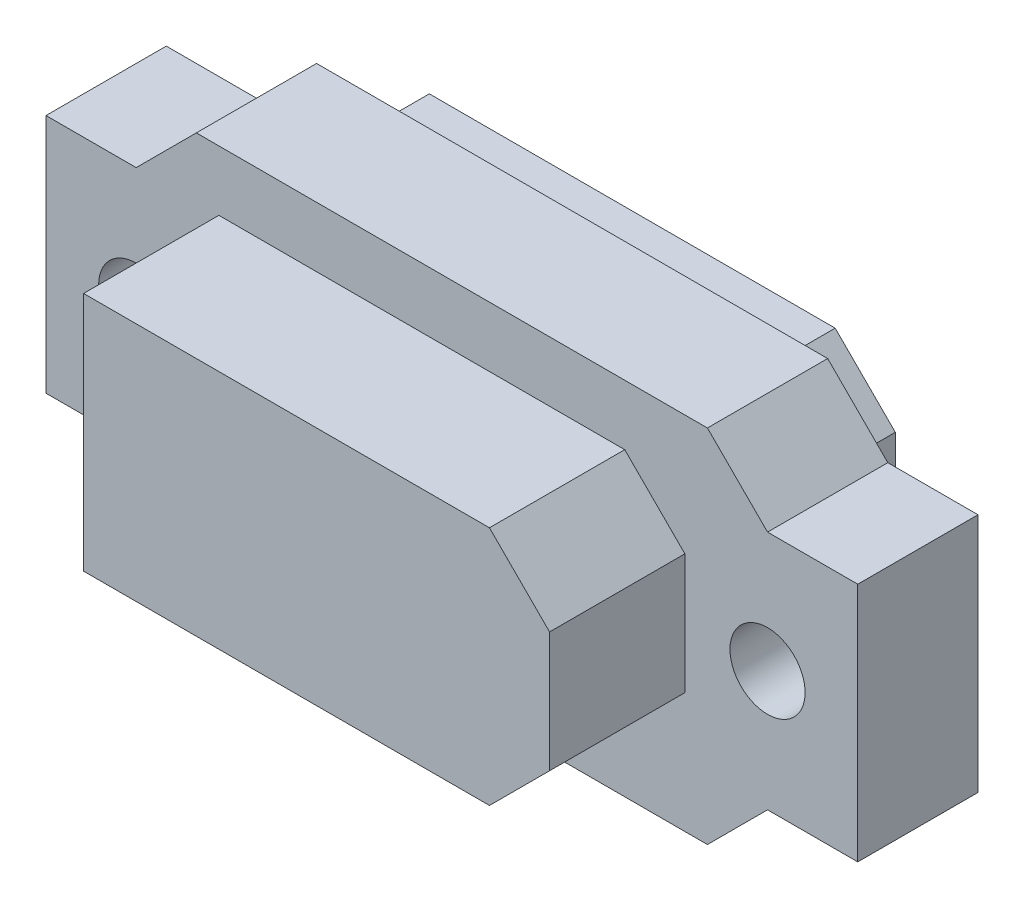
ISO-10303-21;
HEADER;
FILE_DESCRIPTION(('STEP AP214'),'2;1');
FILE_NAME('part.step','',(''),(''),'','','');
FILE_SCHEMA(('AUTOMOTIVE_DESIGN { 1 0 10303 214 1 1 1 1 }'));
ENDSEC;
DATA;
#1=APPLICATION_CONTEXT('core data for automotive mechanical design processes');
#2=APPLICATION_PROTOCOL_DEFINITION('international standard','automotive_design',2000,#1);
#3=PRODUCT_CONTEXT('',#1,'mechanical');
#4=PRODUCT('Part','Part','',(#3));
#5=PRODUCT_RELATED_PRODUCT_CATEGORY('part','',(#4));
#6=PRODUCT_DEFINITION_FORMATION('','',#4);
#7=PRODUCT_DEFINITION_CONTEXT('part definition',#1,'design');
#8=PRODUCT_DEFINITION('design','',#6,#7);
#9=PRODUCT_DEFINITION_SHAPE('','',#8);
#10=(LENGTH_UNIT() NAMED_UNIT(*) SI_UNIT(.MILLI.,.METRE.));
#11=(NAMED_UNIT(*) PLANE_ANGLE_UNIT() SI_UNIT($,.RADIAN.));
#12=(NAMED_UNIT(*) SI_UNIT($,.STERADIAN.) SOLID_ANGLE_UNIT());
#13=UNCERTAINTY_MEASURE_WITH_UNIT(LENGTH_MEASURE(1.E-05),#10,'distance_accuracy_value','');
#14=(GEOMETRIC_REPRESENTATION_CONTEXT(3) GLOBAL_UNCERTAINTY_ASSIGNED_CONTEXT((#13)) GLOBAL_UNIT_ASSIGNED_CONTEXT((#10,
#11,#12)) REPRESENTATION_CONTEXT('',''));
#15=CARTESIAN_POINT('',(0.,0.,0.));
#16=DIRECTION('',(0.,0.,1.));
#17=DIRECTION('',(1.,0.,0.));
#18=AXIS2_PLACEMENT_3D('',#15,#16,#17);
#19=CARTESIAN_POINT('',(-7.25,3.5,11.5));
#20=DIRECTION('',(0.,-1.,0.));
#21=DIRECTION('',(0.,0.,-1.));
#22=AXIS2_PLACEMENT_3D('',#19,#20,#21);
#23=PLANE('',#22);
#24=DIRECTION('',(0.,0.,-1.));
#25=VECTOR('',#24,1.);
#26=CARTESIAN_POINT('',(5.54289321881345,3.5,11.5));
#27=LINE('',#26,#25);
#28=CARTESIAN_POINT('',(5.54289321881345,3.5,9.5));
#29=VERTEX_POINT('',#28);
#30=CARTESIAN_POINT('',(5.54289321881345,3.5,0.));
#31=VERTEX_POINT('',#30);
#32=EDGE_CURVE('E259',#29,#31,#27,.T.);
#33=ORIENTED_EDGE('',*,*,#32,.F.);
#34=DIRECTION('',(-1.,0.,0.));
#35=VECTOR('',#34,1.);
#36=CARTESIAN_POINT('',(5.54289321881345,3.5,9.5));
#37=LINE('',#36,#35);
#38=CARTESIAN_POINT('',(-7.25,3.5,9.5));
#39=VERTEX_POINT('',#38);
#40=EDGE_CURVE('E63',#29,#39,#37,.T.);
#41=ORIENTED_EDGE('',*,*,#40,.T.);
#42=DIRECTION('',(0.,0.,-1.));
#43=VECTOR('',#42,1.);
#44=CARTESIAN_POINT('',(-7.25,3.5,11.5));
#45=LINE('',#44,#43);
#46=CARTESIAN_POINT('',(-7.25,3.5,0.));
#47=VERTEX_POINT('',#46);
#48=EDGE_CURVE('E257',#39,#47,#45,.T.);
#49=ORIENTED_EDGE('',*,*,#48,.T.);
#50=DIRECTION('',(-1.,0.,0.));
#51=VECTOR('',#50,1.);
#52=CARTESIAN_POINT('',(-7.25,3.5,0.));
#53=LINE('',#52,#51);
#54=EDGE_CURVE('E542',#31,#47,#53,.T.);
#55=ORIENTED_EDGE('',*,*,#54,.F.);
#56=EDGE_LOOP('',(#33,#41,#49,#55));
#57=FACE_BOUND('',#56,.T.);
#58=ADVANCED_FACE('F47',(#57),#23,.T.);
#59=CARTESIAN_POINT('',(-7.25,3.5,11.5));
#60=DIRECTION('',(1.,0.,0.));
#61=DIRECTION('',(0.,1.,0.));
#62=AXIS2_PLACEMENT_3D('',#59,#60,#61);
#63=PLANE('',#62);
#64=ORIENTED_EDGE('',*,*,#48,.F.);
#65=DIRECTION('',(0.,-1.,0.));
#66=VECTOR('',#65,1.);
#67=CARTESIAN_POINT('',(-7.25,3.5,9.5));
#68=LINE('',#67,#66);
#69=CARTESIAN_POINT('',(-7.25,-3.5,9.5));
#70=VERTEX_POINT('',#69);
#71=EDGE_CURVE('E245',#39,#70,#68,.T.);
#72=ORIENTED_EDGE('',*,*,#71,.T.);
#73=DIRECTION('',(0.,0.,-1.));
#74=VECTOR('',#73,1.);
#75=CARTESIAN_POINT('',(-7.25,-3.5,11.5));
#76=LINE('',#75,#74);
#77=CARTESIAN_POINT('',(-7.25,-3.5,0.));
#78=VERTEX_POINT('',#77);
#79=EDGE_CURVE('E269',#70,#78,#76,.T.);
#80=ORIENTED_EDGE('',*,*,#79,.T.);
#81=DIRECTION('',(0.,-1.,0.));
#82=VECTOR('',#81,1.);
#83=CARTESIAN_POINT('',(-7.25,3.5,0.));
#84=LINE('',#83,#82);
#85=EDGE_CURVE('E265',#47,#78,#84,.T.);
#86=ORIENTED_EDGE('',*,*,#85,.F.);
#87=EDGE_LOOP('',(#64,#72,#80,#86));
#88=FACE_BOUND('',#87,.T.);
#89=ADVANCED_FACE('F263',(#88),#63,.T.);
#90=CARTESIAN_POINT('',(-7.25,-3.5,11.5));
#91=DIRECTION('',(0.,1.,0.));
#92=DIRECTION('',(0.,0.,1.));
#93=AXIS2_PLACEMENT_3D('',#90,#91,#92);
#94=PLANE('',#93);
#95=ORIENTED_EDGE('',*,*,#79,.F.);
#96=DIRECTION('',(1.,0.,0.));
#97=VECTOR('',#96,1.);
#98=CARTESIAN_POINT('',(-7.25,-3.5,9.5));
#99=LINE('',#98,#97);
#100=CARTESIAN_POINT('',(5.54289321881345,-3.5,9.5));
#101=VERTEX_POINT('',#100);
#102=EDGE_CURVE('E248',#70,#101,#99,.T.);
#103=ORIENTED_EDGE('',*,*,#102,.T.);
#104=DIRECTION('',(0.,0.,-1.));
#105=VECTOR('',#104,1.);
#106=CARTESIAN_POINT('',(5.54289321881345,-3.5,11.5));
#107=LINE('',#106,#105);
#108=CARTESIAN_POINT('',(5.54289321881345,-3.5,0.));
#109=VERTEX_POINT('',#108);
#110=EDGE_CURVE('E276',#101,#109,#107,.T.);
#111=ORIENTED_EDGE('',*,*,#110,.T.);
#112=DIRECTION('',(1.,0.,0.));
#113=VECTOR('',#112,1.);
#114=CARTESIAN_POINT('',(-7.25,-3.5,0.));
#115=LINE('',#114,#113);
#116=EDGE_CURVE('E583',#78,#109,#115,.T.);
#117=ORIENTED_EDGE('',*,*,#116,.F.);
#118=EDGE_LOOP('',(#95,#103,#111,#117));
#119=FACE_BOUND('',#118,.T.);
#120=ADVANCED_FACE('F372',(#119),#94,.T.);
#121=CARTESIAN_POINT('',(5.54289321881345,-3.5,11.5));
#122=DIRECTION('',(-0.707106781186548,0.707106781186547,0.));
#123=DIRECTION('',(-0.707106781186547,-0.707106781186548,0.));
#124=AXIS2_PLACEMENT_3D('',#121,#122,#123);
#125=PLANE('',#124);
#126=ORIENTED_EDGE('',*,*,#110,.F.);
#127=DIRECTION('',(0.707106781186547,0.707106781186548,0.));
#128=VECTOR('',#127,1.);
#129=CARTESIAN_POINT('',(5.54289321881345,-3.5,9.5));
#130=LINE('',#129,#128);
#131=CARTESIAN_POINT('',(7.25,-1.79289321881345,9.5));
#132=VERTEX_POINT('',#131);
#133=EDGE_CURVE('E625',#101,#132,#130,.T.);
#134=ORIENTED_EDGE('',*,*,#133,.T.);
#135=DIRECTION('',(0.,0.,-1.));
#136=VECTOR('',#135,1.);
#137=CARTESIAN_POINT('',(7.25,-1.79289321881345,11.5));
#138=LINE('',#137,#136);
#139=CARTESIAN_POINT('',(7.25,-1.79289321881345,0.));
#140=VERTEX_POINT('',#139);
#141=EDGE_CURVE('E604',#132,#140,#138,.T.);
#142=ORIENTED_EDGE('',*,*,#141,.T.);
#143=DIRECTION('',(0.707106781186547,0.707106781186548,0.));
#144=VECTOR('',#143,1.);
#145=CARTESIAN_POINT('',(5.54289321881345,-3.5,0.));
#146=LINE('',#145,#144);
#147=EDGE_CURVE('E587',#109,#140,#146,.T.);
#148=ORIENTED_EDGE('',*,*,#147,.F.);
#149=EDGE_LOOP('',(#126,#134,#142,#148));
#150=FACE_BOUND('',#149,.T.);
#151=ADVANCED_FACE('F613',(#150),#125,.T.);
#152=CARTESIAN_POINT('',(7.25,1.79289321881345,11.5));
#153=DIRECTION('',(-1.,0.,0.));
#154=DIRECTION('',(0.,0.,1.));
#155=AXIS2_PLACEMENT_3D('',#152,#153,#154);
#156=PLANE('',#155);
#157=ORIENTED_EDGE('',*,*,#141,.F.);
#158=DIRECTION('',(0.,1.,0.));
#159=VECTOR('',#158,1.);
#160=CARTESIAN_POINT('',(7.25,-1.79289321881345,9.5));
#161=LINE('',#160,#159);
#162=CARTESIAN_POINT('',(7.25,1.79289321881345,9.5));
#163=VERTEX_POINT('',#162);
#164=EDGE_CURVE('E622',#132,#163,#161,.T.);
#165=ORIENTED_EDGE('',*,*,#164,.T.);
#166=DIRECTION('',(0.,0.,-1.));
#167=VECTOR('',#166,1.);
#168=CARTESIAN_POINT('',(7.25,1.79289321881345,11.5));
#169=LINE('',#168,#167);
#170=CARTESIAN_POINT('',(7.25,1.79289321881345,0.));
#171=VERTEX_POINT('',#170);
#172=EDGE_CURVE('E601',#163,#171,#169,.T.);
#173=ORIENTED_EDGE('',*,*,#172,.T.);
#174=DIRECTION('',(0.,1.,0.));
#175=VECTOR('',#174,1.);
#176=CARTESIAN_POINT('',(7.25,1.79289321881345,0.));
#177=LINE('',#176,#175);
#178=EDGE_CURVE('E591',#140,#171,#177,.T.);
#179=ORIENTED_EDGE('',*,*,#178,.F.);
#180=EDGE_LOOP('',(#157,#165,#173,#179));
#181=FACE_BOUND('',#180,.T.);
#182=ADVANCED_FACE('F749',(#181),#156,.T.);
#183=CARTESIAN_POINT('',(5.54289321881345,3.5,11.5));
#184=DIRECTION('',(-0.707106781186547,-0.707106781186548,0.));
#185=DIRECTION('',(0.707106781186548,-0.707106781186547,0.));
#186=AXIS2_PLACEMENT_3D('',#183,#184,#185);
#187=PLANE('',#186);
#188=ORIENTED_EDGE('',*,*,#172,.F.);
#189=DIRECTION('',(-0.707106781186548,0.707106781186547,0.));
#190=VECTOR('',#189,1.);
#191=CARTESIAN_POINT('',(7.25,1.79289321881345,9.5));
#192=LINE('',#191,#190);
#193=EDGE_CURVE('E465',#163,#29,#192,.T.);
#194=ORIENTED_EDGE('',*,*,#193,.T.);
#195=ORIENTED_EDGE('',*,*,#32,.T.);
#196=DIRECTION('',(-0.707106781186548,0.707106781186547,0.));
#197=VECTOR('',#196,1.);
#198=CARTESIAN_POINT('',(5.54289321881345,3.5,0.));
#199=LINE('',#198,#197);
#200=EDGE_CURVE('E595',#171,#31,#199,.T.);
#201=ORIENTED_EDGE('',*,*,#200,.F.);
#202=EDGE_LOOP('',(#188,#194,#195,#201));
#203=FACE_BOUND('',#202,.T.);
#204=ADVANCED_FACE('F420',(#203),#187,.T.);
#205=CARTESIAN_POINT('',(-7.75,4.,11.5));
#206=DIRECTION('',(1.,0.,0.));
#207=DIRECTION('',(0.,1.,0.));
#208=AXIS2_PLACEMENT_3D('',#205,#206,#207);
#209=PLANE('',#208);
#210=DIRECTION('',(0.,1.,0.));
#211=VECTOR('',#210,1.);
#212=CARTESIAN_POINT('',(-7.75,0.,7.));
#213=LINE('',#212,#211);
#214=CARTESIAN_POINT('',(-7.75,-4.,7.));
#215=VERTEX_POINT('',#214);
#216=CARTESIAN_POINT('',(-7.75,4.,7.));
#217=VERTEX_POINT('',#216);
#218=EDGE_CURVE('E71',#215,#217,#213,.T.);
#219=ORIENTED_EDGE('',*,*,#218,.F.);
#220=DIRECTION('',(0.,0.,-1.));
#221=VECTOR('',#220,1.);
#222=CARTESIAN_POINT('',(-7.75,-4.,11.5));
#223=LINE('',#222,#221);
#224=CARTESIAN_POINT('',(-7.75,-4.,11.5));
#225=VERTEX_POINT('',#224);
#226=EDGE_CURVE('E342',#225,#215,#223,.T.);
#227=ORIENTED_EDGE('',*,*,#226,.F.);
#228=DIRECTION('',(0.,-1.,0.));
#229=VECTOR('',#228,1.);
#230=CARTESIAN_POINT('',(-7.75,4.,11.5));
#231=LINE('',#230,#229);
#232=CARTESIAN_POINT('',(-7.75,4.,11.5));
#233=VERTEX_POINT('',#232);
#234=EDGE_CURVE('E280',#233,#225,#231,.T.);
#235=ORIENTED_EDGE('',*,*,#234,.F.);
#236=DIRECTION('',(0.,0.,-1.));
#237=VECTOR('',#236,1.);
#238=CARTESIAN_POINT('',(-7.75,4.,11.5));
#239=LINE('',#238,#237);
#240=EDGE_CURVE('E319',#233,#217,#239,.T.);
#241=ORIENTED_EDGE('',*,*,#240,.T.);
#242=EDGE_LOOP('',(#219,#227,#235,#241));
#243=FACE_BOUND('',#242,.T.);
#244=ADVANCED_FACE('F411',(#243),#209,.F.);
#245=CARTESIAN_POINT('',(-7.75,-4.,11.5));
#246=DIRECTION('',(0.,1.,0.));
#247=DIRECTION('',(0.,0.,1.));
#248=AXIS2_PLACEMENT_3D('',#245,#246,#247);
#249=PLANE('',#248);
#250=DIRECTION('',(-1.,0.,0.));
#251=VECTOR('',#250,1.);
#252=CARTESIAN_POINT('',(0.,-4.,7.));
#253=LINE('',#252,#251);
#254=CARTESIAN_POINT('',(5.75,-4.,7.));
#255=VERTEX_POINT('',#254);
#256=EDGE_CURVE('E423',#255,#215,#253,.T.);
#257=ORIENTED_EDGE('',*,*,#256,.F.);
#258=DIRECTION('',(0.,0.,-1.));
#259=VECTOR('',#258,1.);
#260=CARTESIAN_POINT('',(5.75,-4.,11.5));
#261=LINE('',#260,#259);
#262=CARTESIAN_POINT('',(5.75,-4.,11.5));
#263=VERTEX_POINT('',#262);
#264=EDGE_CURVE('E337',#263,#255,#261,.T.);
#265=ORIENTED_EDGE('',*,*,#264,.F.);
#266=DIRECTION('',(1.,0.,0.));
#267=VECTOR('',#266,1.);
#268=CARTESIAN_POINT('',(-7.75,-4.,11.5));
#269=LINE('',#268,#267);
#270=EDGE_CURVE('E284',#225,#263,#269,.T.);
#271=ORIENTED_EDGE('',*,*,#270,.F.);
#272=ORIENTED_EDGE('',*,*,#226,.T.);
#273=EDGE_LOOP('',(#257,#265,#271,#272));
#274=FACE_BOUND('',#273,.T.);
#275=ADVANCED_FACE('F406',(#274),#249,.F.);
#276=CARTESIAN_POINT('',(5.75,-4.,11.5));
#277=DIRECTION('',(-0.707106781186547,0.707106781186547,0.));
#278=DIRECTION('',(-0.707106781186548,-0.707106781186548,0.));
#279=AXIS2_PLACEMENT_3D('',#276,#277,#278);
#280=PLANE('',#279);
#281=DIRECTION('',(-0.707106781186548,-0.707106781186548,0.));
#282=VECTOR('',#281,1.);
#283=CARTESIAN_POINT('',(4.875,-4.875,7.));
#284=LINE('',#283,#282);
#285=CARTESIAN_POINT('',(7.75,-2.,7.));
#286=VERTEX_POINT('',#285);
#287=EDGE_CURVE('E428',#286,#255,#284,.T.);
#288=ORIENTED_EDGE('',*,*,#287,.F.);
#289=DIRECTION('',(0.,0.,-1.));
#290=VECTOR('',#289,1.);
#291=CARTESIAN_POINT('',(7.75,-2.,11.5));
#292=LINE('',#291,#290);
#293=CARTESIAN_POINT('',(7.75,-2.,11.5));
#294=VERTEX_POINT('',#293);
#295=EDGE_CURVE('E332',#294,#286,#292,.T.);
#296=ORIENTED_EDGE('',*,*,#295,.F.);
#297=DIRECTION('',(0.707106781186548,0.707106781186548,0.));
#298=VECTOR('',#297,1.);
#299=CARTESIAN_POINT('',(5.75,-4.,11.5));
#300=LINE('',#299,#298);
#301=EDGE_CURVE('E288',#263,#294,#300,.T.);
#302=ORIENTED_EDGE('',*,*,#301,.F.);
#303=ORIENTED_EDGE('',*,*,#264,.T.);
#304=EDGE_LOOP('',(#288,#296,#302,#303));
#305=FACE_BOUND('',#304,.T.);
#306=ADVANCED_FACE('F403',(#305),#280,.F.);
#307=CARTESIAN_POINT('',(7.75,2.,11.5));
#308=DIRECTION('',(-1.,0.,0.));
#309=DIRECTION('',(0.,0.,1.));
#310=AXIS2_PLACEMENT_3D('',#307,#308,#309);
#311=PLANE('',#310);
#312=DIRECTION('',(0.,-1.,0.));
#313=VECTOR('',#312,1.);
#314=CARTESIAN_POINT('',(7.75,0.,7.));
#315=LINE('',#314,#313);
#316=CARTESIAN_POINT('',(7.75,2.,7.));
#317=VERTEX_POINT('',#316);
#318=EDGE_CURVE('E435',#317,#286,#315,.T.);
#319=ORIENTED_EDGE('',*,*,#318,.F.);
#320=DIRECTION('',(0.,0.,-1.));
#321=VECTOR('',#320,1.);
#322=CARTESIAN_POINT('',(7.75,2.,11.5));
#323=LINE('',#322,#321);
#324=CARTESIAN_POINT('',(7.75,2.,11.5));
#325=VERTEX_POINT('',#324);
#326=EDGE_CURVE('E327',#325,#317,#323,.T.);
#327=ORIENTED_EDGE('',*,*,#326,.F.);
#328=DIRECTION('',(0.,1.,0.));
#329=VECTOR('',#328,1.);
#330=CARTESIAN_POINT('',(7.75,2.,11.5));
#331=LINE('',#330,#329);
#332=EDGE_CURVE('E291',#294,#325,#331,.T.);
#333=ORIENTED_EDGE('',*,*,#332,.F.);
#334=ORIENTED_EDGE('',*,*,#295,.T.);
#335=EDGE_LOOP('',(#319,#327,#333,#334));
#336=FACE_BOUND('',#335,.T.);
#337=ADVANCED_FACE('F399',(#336),#311,.F.);
#338=CARTESIAN_POINT('',(5.75,4.,11.5));
#339=DIRECTION('',(-0.707106781186547,-0.707106781186547,0.));
#340=DIRECTION('',(0.707106781186548,-0.707106781186548,0.));
#341=AXIS2_PLACEMENT_3D('',#338,#339,#340);
#342=PLANE('',#341);
#343=DIRECTION('',(0.707106781186548,-0.707106781186548,0.));
#344=VECTOR('',#343,1.);
#345=CARTESIAN_POINT('',(4.875,4.875,7.));
#346=LINE('',#345,#344);
#347=CARTESIAN_POINT('',(5.75,4.,7.));
#348=VERTEX_POINT('',#347);
#349=EDGE_CURVE('E439',#348,#317,#346,.T.);
#350=ORIENTED_EDGE('',*,*,#349,.F.);
#351=DIRECTION('',(0.,0.,-1.));
#352=VECTOR('',#351,1.);
#353=CARTESIAN_POINT('',(5.75,4.,11.5));
#354=LINE('',#353,#352);
#355=CARTESIAN_POINT('',(5.75,4.,11.5));
#356=VERTEX_POINT('',#355);
#357=EDGE_CURVE('E323',#356,#348,#354,.T.);
#358=ORIENTED_EDGE('',*,*,#357,.F.);
#359=DIRECTION('',(-0.707106781186548,0.707106781186548,0.));
#360=VECTOR('',#359,1.);
#361=CARTESIAN_POINT('',(5.75,4.,11.5));
#362=LINE('',#361,#360);
#363=EDGE_CURVE('E294',#325,#356,#362,.T.);
#364=ORIENTED_EDGE('',*,*,#363,.F.);
#365=ORIENTED_EDGE('',*,*,#326,.T.);
#366=EDGE_LOOP('',(#350,#358,#364,#365));
#367=FACE_BOUND('',#366,.T.);
#368=ADVANCED_FACE('F394',(#367),#342,.F.);
#369=CARTESIAN_POINT('',(-7.75,4.,11.5));
#370=DIRECTION('',(0.,-1.,0.));
#371=DIRECTION('',(0.,0.,-1.));
#372=AXIS2_PLACEMENT_3D('',#369,#370,#371);
#373=PLANE('',#372);
#374=DIRECTION('',(1.,0.,0.));
#375=VECTOR('',#374,1.);
#376=CARTESIAN_POINT('',(0.,4.,7.));
#377=LINE('',#376,#375);
#378=EDGE_CURVE('E445',#217,#348,#377,.T.);
#379=ORIENTED_EDGE('',*,*,#378,.F.);
#380=ORIENTED_EDGE('',*,*,#240,.F.);
#381=DIRECTION('',(-1.,0.,0.));
#382=VECTOR('',#381,1.);
#383=CARTESIAN_POINT('',(-7.75,4.,11.5));
#384=LINE('',#383,#382);
#385=EDGE_CURVE('E297',#356,#233,#384,.T.);
#386=ORIENTED_EDGE('',*,*,#385,.F.);
#387=ORIENTED_EDGE('',*,*,#357,.T.);
#388=EDGE_LOOP('',(#379,#380,#386,#387));
#389=FACE_BOUND('',#388,.T.);
#390=ADVANCED_FACE('F379',(#389),#373,.F.);
#391=CARTESIAN_POINT('',(0.,0.,11.5));
#392=DIRECTION('',(0.,0.,1.));
#393=DIRECTION('',(1.,0.,0.));
#394=AXIS2_PLACEMENT_3D('',#391,#392,#393);
#395=PLANE('',#394);
#396=ORIENTED_EDGE('',*,*,#234,.T.);
#397=ORIENTED_EDGE('',*,*,#270,.T.);
#398=ORIENTED_EDGE('',*,*,#301,.T.);
#399=ORIENTED_EDGE('',*,*,#332,.T.);
#400=ORIENTED_EDGE('',*,*,#363,.T.);
#401=ORIENTED_EDGE('',*,*,#385,.T.);
#402=EDGE_LOOP('',(#396,#397,#398,#399,#400,#401));
#403=FACE_BOUND('',#402,.T.);
#404=ADVANCED_FACE('F376',(#403),#395,.T.);
#405=CARTESIAN_POINT('',(0.,0.,0.));
#406=DIRECTION('',(0.,0.,1.));
#407=DIRECTION('',(1.,0.,0.));
#408=AXIS2_PLACEMENT_3D('',#405,#406,#407);
#409=PLANE('',#408);
#410=DIRECTION('',(0.,-1.,0.));
#411=VECTOR('',#410,1.);
#412=CARTESIAN_POINT('',(-7.75,4.,0.));
#413=LINE('',#412,#411);
#414=CARTESIAN_POINT('',(-7.75,4.,0.));
#415=VERTEX_POINT('',#414);
#416=CARTESIAN_POINT('',(-7.75,-4.,0.));
#417=VERTEX_POINT('',#416);
#418=EDGE_CURVE('E268',#415,#417,#413,.T.);
#419=ORIENTED_EDGE('',*,*,#418,.F.);
#420=DIRECTION('',(-1.,0.,0.));
#421=VECTOR('',#420,1.);
#422=CARTESIAN_POINT('',(-7.75,4.,0.));
#423=LINE('',#422,#421);
#424=CARTESIAN_POINT('',(5.75,4.,0.));
#425=VERTEX_POINT('',#424);
#426=EDGE_CURVE('E285',#425,#415,#423,.T.);
#427=ORIENTED_EDGE('',*,*,#426,.F.);
#428=DIRECTION('',(-0.707106781186548,0.707106781186548,0.));
#429=VECTOR('',#428,1.);
#430=CARTESIAN_POINT('',(5.75,4.,0.));
#431=LINE('',#430,#429);
#432=CARTESIAN_POINT('',(7.75,2.,0.));
#433=VERTEX_POINT('',#432);
#434=EDGE_CURVE('E312',#433,#425,#431,.T.);
#435=ORIENTED_EDGE('',*,*,#434,.F.);
#436=DIRECTION('',(0.,1.,0.));
#437=VECTOR('',#436,1.);
#438=CARTESIAN_POINT('',(7.75,2.,0.));
#439=LINE('',#438,#437);
#440=CARTESIAN_POINT('',(7.75,-2.,0.));
#441=VERTEX_POINT('',#440);
#442=EDGE_CURVE('E308',#441,#433,#439,.T.);
#443=ORIENTED_EDGE('',*,*,#442,.F.);
#444=DIRECTION('',(0.707106781186548,0.707106781186548,0.));
#445=VECTOR('',#444,1.);
#446=CARTESIAN_POINT('',(5.75,-4.,0.));
#447=LINE('',#446,#445);
#448=CARTESIAN_POINT('',(5.75,-4.,0.));
#449=VERTEX_POINT('',#448);
#450=EDGE_CURVE('E304',#449,#441,#447,.T.);
#451=ORIENTED_EDGE('',*,*,#450,.F.);
#452=DIRECTION('',(1.,0.,0.));
#453=VECTOR('',#452,1.);
#454=CARTESIAN_POINT('',(-7.75,-4.,0.));
#455=LINE('',#454,#453);
#456=EDGE_CURVE('E274',#417,#449,#455,.T.);
#457=ORIENTED_EDGE('',*,*,#456,.F.);
#458=EDGE_LOOP('',(#419,#427,#435,#443,#451,#457));
#459=FACE_BOUND('',#458,.T.);
#460=ORIENTED_EDGE('',*,*,#54,.T.);
#461=ORIENTED_EDGE('',*,*,#85,.T.);
#462=ORIENTED_EDGE('',*,*,#116,.T.);
#463=ORIENTED_EDGE('',*,*,#147,.T.);
#464=ORIENTED_EDGE('',*,*,#178,.T.);
#465=ORIENTED_EDGE('',*,*,#200,.T.);
#466=EDGE_LOOP('',(#460,#461,#462,#463,#464,#465));
#467=FACE_BOUND('',#466,.T.);
#468=ADVANCED_FACE('F378',(#459,#467),#409,.F.);
#469=CARTESIAN_POINT('',(-7.75,-4.,3.));
#470=VERTEX_POINT('',#469);
#471=EDGE_CURVE('E341',#470,#417,#223,.T.);
#472=ORIENTED_EDGE('',*,*,#471,.F.);
#473=DIRECTION('',(0.,1.,0.));
#474=VECTOR('',#473,1.);
#475=CARTESIAN_POINT('',(-7.75,0.,3.));
#476=LINE('',#475,#474);
#477=CARTESIAN_POINT('',(-7.75,4.,3.));
#478=VERTEX_POINT('',#477);
#479=EDGE_CURVE('E525',#470,#478,#476,.T.);
#480=ORIENTED_EDGE('',*,*,#479,.T.);
#481=EDGE_CURVE('E299',#478,#415,#239,.T.);
#482=ORIENTED_EDGE('',*,*,#481,.T.);
#483=ORIENTED_EDGE('',*,*,#418,.T.);
#484=EDGE_LOOP('',(#472,#480,#482,#483));
#485=FACE_BOUND('',#484,.T.);
#486=ADVANCED_FACE('F49',(#485),#209,.F.);
#487=CARTESIAN_POINT('',(5.75,-4.,3.));
#488=VERTEX_POINT('',#487);
#489=EDGE_CURVE('E336',#488,#449,#261,.T.);
#490=ORIENTED_EDGE('',*,*,#489,.F.);
#491=DIRECTION('',(-1.,0.,0.));
#492=VECTOR('',#491,1.);
#493=CARTESIAN_POINT('',(0.,-4.,3.));
#494=LINE('',#493,#492);
#495=EDGE_CURVE('E505',#488,#470,#494,.T.);
#496=ORIENTED_EDGE('',*,*,#495,.T.);
#497=ORIENTED_EDGE('',*,*,#471,.T.);
#498=ORIENTED_EDGE('',*,*,#456,.T.);
#499=EDGE_LOOP('',(#490,#496,#497,#498));
#500=FACE_BOUND('',#499,.T.);
#501=ADVANCED_FACE('F401',(#500),#249,.F.);
#502=CARTESIAN_POINT('',(7.75,-2.,3.));
#503=VERTEX_POINT('',#502);
#504=EDGE_CURVE('E331',#503,#441,#292,.T.);
#505=ORIENTED_EDGE('',*,*,#504,.F.);
#506=DIRECTION('',(-0.707106781186548,-0.707106781186548,0.));
#507=VECTOR('',#506,1.);
#508=CARTESIAN_POINT('',(4.875,-4.875,3.));
#509=LINE('',#508,#507);
#510=EDGE_CURVE('E509',#503,#488,#509,.T.);
#511=ORIENTED_EDGE('',*,*,#510,.T.);
#512=ORIENTED_EDGE('',*,*,#489,.T.);
#513=ORIENTED_EDGE('',*,*,#450,.T.);
#514=EDGE_LOOP('',(#505,#511,#512,#513));
#515=FACE_BOUND('',#514,.T.);
#516=ADVANCED_FACE('F397',(#515),#280,.F.);
#517=CARTESIAN_POINT('',(7.75,2.,3.));
#518=VERTEX_POINT('',#517);
#519=EDGE_CURVE('E326',#518,#433,#323,.T.);
#520=ORIENTED_EDGE('',*,*,#519,.F.);
#521=DIRECTION('',(0.,-1.,0.));
#522=VECTOR('',#521,1.);
#523=CARTESIAN_POINT('',(7.75,0.,3.));
#524=LINE('',#523,#522);
#525=EDGE_CURVE('E513',#518,#503,#524,.T.);
#526=ORIENTED_EDGE('',*,*,#525,.T.);
#527=ORIENTED_EDGE('',*,*,#504,.T.);
#528=ORIENTED_EDGE('',*,*,#442,.T.);
#529=EDGE_LOOP('',(#520,#526,#527,#528));
#530=FACE_BOUND('',#529,.T.);
#531=ADVANCED_FACE('F392',(#530),#311,.F.);
#532=CARTESIAN_POINT('',(5.75,4.,3.));
#533=VERTEX_POINT('',#532);
#534=EDGE_CURVE('E322',#533,#425,#354,.T.);
#535=ORIENTED_EDGE('',*,*,#534,.F.);
#536=DIRECTION('',(0.707106781186548,-0.707106781186548,0.));
#537=VECTOR('',#536,1.);
#538=CARTESIAN_POINT('',(4.875,4.875,3.));
#539=LINE('',#538,#537);
#540=EDGE_CURVE('E517',#533,#518,#539,.T.);
#541=ORIENTED_EDGE('',*,*,#540,.T.);
#542=ORIENTED_EDGE('',*,*,#519,.T.);
#543=ORIENTED_EDGE('',*,*,#434,.T.);
#544=EDGE_LOOP('',(#535,#541,#542,#543));
#545=FACE_BOUND('',#544,.T.);
#546=ADVANCED_FACE('F388',(#545),#342,.F.);
#547=ORIENTED_EDGE('',*,*,#481,.F.);
#548=DIRECTION('',(1.,0.,0.));
#549=VECTOR('',#548,1.);
#550=CARTESIAN_POINT('',(0.,4.,3.));
#551=LINE('',#550,#549);
#552=EDGE_CURVE('E521',#478,#533,#551,.T.);
#553=ORIENTED_EDGE('',*,*,#552,.T.);
#554=ORIENTED_EDGE('',*,*,#534,.T.);
#555=ORIENTED_EDGE('',*,*,#426,.T.);
#556=EDGE_LOOP('',(#547,#553,#554,#555));
#557=FACE_BOUND('',#556,.T.);
#558=ADVANCED_FACE('F384',(#557),#373,.F.);
#559=CARTESIAN_POINT('',(13.5,0.,7.));
#560=DIRECTION('',(-1.,0.,0.));
#561=DIRECTION('',(0.,-1.,0.));
#562=AXIS2_PLACEMENT_3D('',#559,#560,#561);
#563=PLANE('',#562);
#564=DIRECTION('',(0.,1.,0.));
#565=VECTOR('',#564,1.);
#566=CARTESIAN_POINT('',(13.5,0.,3.));
#567=LINE('',#566,#565);
#568=CARTESIAN_POINT('',(13.5,-4.,3.));
#569=VERTEX_POINT('',#568);
#570=CARTESIAN_POINT('',(13.5,4.,3.));
#571=VERTEX_POINT('',#570);
#572=EDGE_CURVE('E460',#569,#571,#567,.T.);
#573=ORIENTED_EDGE('',*,*,#572,.T.);
#574=DIRECTION('',(0.,0.,-1.));
#575=VECTOR('',#574,1.);
#576=CARTESIAN_POINT('',(13.5,4.,7.));
#577=LINE('',#576,#575);
#578=CARTESIAN_POINT('',(13.5,4.,7.));
#579=VERTEX_POINT('',#578);
#580=EDGE_CURVE('E538',#579,#571,#577,.T.);
#581=ORIENTED_EDGE('',*,*,#580,.F.);
#582=DIRECTION('',(0.,1.,0.));
#583=VECTOR('',#582,1.);
#584=CARTESIAN_POINT('',(13.5,0.,7.));
#585=LINE('',#584,#583);
#586=CARTESIAN_POINT('',(13.5,-4.,7.));
#587=VERTEX_POINT('',#586);
#588=EDGE_CURVE('E537',#587,#579,#585,.T.);
#589=ORIENTED_EDGE('',*,*,#588,.F.);
#590=DIRECTION('',(0.,0.,-1.));
#591=VECTOR('',#590,1.);
#592=CARTESIAN_POINT('',(13.5,-4.,7.));
#593=LINE('',#592,#591);
#594=EDGE_CURVE('E459',#587,#569,#593,.T.);
#595=ORIENTED_EDGE('',*,*,#594,.T.);
#596=EDGE_LOOP('',(#573,#581,#589,#595));
#597=FACE_BOUND('',#596,.T.);
#598=ADVANCED_FACE('F387',(#597),#563,.F.);
#599=CARTESIAN_POINT('',(0.,4.,7.));
#600=DIRECTION('',(0.,-1.,0.));
#601=DIRECTION('',(0.,0.,-1.));
#602=AXIS2_PLACEMENT_3D('',#599,#600,#601);
#603=PLANE('',#602);
#604=DIRECTION('',(-1.,0.,0.));
#605=VECTOR('',#604,1.);
#606=CARTESIAN_POINT('',(0.,4.,3.));
#607=LINE('',#606,#605);
#608=CARTESIAN_POINT('',(10.5,4.,3.));
#609=VERTEX_POINT('',#608);
#610=EDGE_CURVE('E502',#571,#609,#607,.T.);
#611=ORIENTED_EDGE('',*,*,#610,.T.);
#612=DIRECTION('',(0.,0.,-1.));
#613=VECTOR('',#612,1.);
#614=CARTESIAN_POINT('',(10.5,4.,7.));
#615=LINE('',#614,#613);
#616=CARTESIAN_POINT('',(10.5,4.,7.));
#617=VERTEX_POINT('',#616);
#618=EDGE_CURVE('E543',#617,#609,#615,.T.);
#619=ORIENTED_EDGE('',*,*,#618,.F.);
#620=DIRECTION('',(-1.,0.,0.));
#621=VECTOR('',#620,1.);
#622=CARTESIAN_POINT('',(0.,4.,7.));
#623=LINE('',#622,#621);
#624=EDGE_CURVE('E429',#579,#617,#623,.T.);
#625=ORIENTED_EDGE('',*,*,#624,.F.);
#626=ORIENTED_EDGE('',*,*,#580,.T.);
#627=EDGE_LOOP('',(#611,#619,#625,#626));
#628=FACE_BOUND('',#627,.T.);
#629=ADVANCED_FACE('F675',(#628),#603,.F.);
#630=CARTESIAN_POINT('',(7.25000000000002,7.24999999999999,7.));
#631=DIRECTION('',(-0.707106781186549,-0.707106781186546,0.));
#632=DIRECTION('',(0.707106781186546,-0.707106781186549,0.));
#633=AXIS2_PLACEMENT_3D('',#630,#631,#632);
#634=PLANE('',#633);
#635=DIRECTION('',(-0.707106781186546,0.707106781186549,0.));
#636=VECTOR('',#635,1.);
#637=CARTESIAN_POINT('',(7.25000000000002,7.24999999999999,3.));
#638=LINE('',#637,#636);
#639=CARTESIAN_POINT('',(8.50000000000001,6.,3.));
#640=VERTEX_POINT('',#639);
#641=EDGE_CURVE('E499',#609,#640,#638,.T.);
#642=ORIENTED_EDGE('',*,*,#641,.T.);
#643=DIRECTION('',(0.,0.,-1.));
#644=VECTOR('',#643,1.);
#645=CARTESIAN_POINT('',(8.50000000000001,6.,7.));
#646=LINE('',#645,#644);
#647=CARTESIAN_POINT('',(8.50000000000001,6.,7.));
#648=VERTEX_POINT('',#647);
#649=EDGE_CURVE('E547',#648,#640,#646,.T.);
#650=ORIENTED_EDGE('',*,*,#649,.F.);
#651=DIRECTION('',(-0.707106781186546,0.707106781186549,0.));
#652=VECTOR('',#651,1.);
#653=CARTESIAN_POINT('',(7.25000000000002,7.24999999999999,7.));
#654=LINE('',#653,#652);
#655=EDGE_CURVE('E664',#617,#648,#654,.T.);
#656=ORIENTED_EDGE('',*,*,#655,.F.);
#657=ORIENTED_EDGE('',*,*,#618,.T.);
#658=EDGE_LOOP('',(#642,#650,#656,#657));
#659=FACE_BOUND('',#658,.T.);
#660=ADVANCED_FACE('F678',(#659),#634,.F.);
#661=CARTESIAN_POINT('',(0.,6.,7.));
#662=DIRECTION('',(0.,-1.,0.));
#663=DIRECTION('',(0.,0.,-1.));
#664=AXIS2_PLACEMENT_3D('',#661,#662,#663);
#665=PLANE('',#664);
#666=DIRECTION('',(-1.,0.,0.));
#667=VECTOR('',#666,1.);
#668=CARTESIAN_POINT('',(0.,6.,3.));
#669=LINE('',#668,#667);
#670=CARTESIAN_POINT('',(-8.50000000000001,6.,3.));
#671=VERTEX_POINT('',#670);
#672=EDGE_CURVE('E495',#640,#671,#669,.T.);
#673=ORIENTED_EDGE('',*,*,#672,.T.);
#674=DIRECTION('',(0.,0.,-1.));
#675=VECTOR('',#674,1.);
#676=CARTESIAN_POINT('',(-8.50000000000001,6.,7.));
#677=LINE('',#676,#675);
#678=CARTESIAN_POINT('',(-8.50000000000001,6.,7.));
#679=VERTEX_POINT('',#678);
#680=EDGE_CURVE('E551',#679,#671,#677,.T.);
#681=ORIENTED_EDGE('',*,*,#680,.F.);
#682=DIRECTION('',(-1.,0.,0.));
#683=VECTOR('',#682,1.);
#684=CARTESIAN_POINT('',(0.,6.,7.));
#685=LINE('',#684,#683);
#686=EDGE_CURVE('E661',#648,#679,#685,.T.);
#687=ORIENTED_EDGE('',*,*,#686,.F.);
#688=ORIENTED_EDGE('',*,*,#649,.T.);
#689=EDGE_LOOP('',(#673,#681,#687,#688));
#690=FACE_BOUND('',#689,.T.);
#691=ADVANCED_FACE('F683',(#690),#665,.F.);
#692=CARTESIAN_POINT('',(-7.25000000000002,7.24999999999999,7.));
#693=DIRECTION('',(-0.707106781186549,0.707106781186546,0.));
#694=DIRECTION('',(-0.707106781186546,-0.707106781186549,0.));
#695=AXIS2_PLACEMENT_3D('',#692,#693,#694);
#696=PLANE('',#695);
#697=DIRECTION('',(0.707106781186546,0.707106781186549,0.));
#698=VECTOR('',#697,1.);
#699=CARTESIAN_POINT('',(-7.25000000000002,7.24999999999999,3.));
#700=LINE('',#699,#698);
#701=CARTESIAN_POINT('',(-10.5,4.,3.));
#702=VERTEX_POINT('',#701);
#703=EDGE_CURVE('E491',#702,#671,#700,.T.);
#704=ORIENTED_EDGE('',*,*,#703,.F.);
#705=DIRECTION('',(0.,0.,-1.));
#706=VECTOR('',#705,1.);
#707=CARTESIAN_POINT('',(-10.5,4.,7.));
#708=LINE('',#707,#706);
#709=CARTESIAN_POINT('',(-10.5,4.,7.));
#710=VERTEX_POINT('',#709);
#711=EDGE_CURVE('E554',#710,#702,#708,.T.);
#712=ORIENTED_EDGE('',*,*,#711,.F.);
#713=DIRECTION('',(0.707106781186546,0.707106781186549,0.));
#714=VECTOR('',#713,1.);
#715=CARTESIAN_POINT('',(-7.25000000000002,7.24999999999999,7.));
#716=LINE('',#715,#714);
#717=EDGE_CURVE('E657',#710,#679,#716,.T.);
#718=ORIENTED_EDGE('',*,*,#717,.T.);
#719=ORIENTED_EDGE('',*,*,#680,.T.);
#720=EDGE_LOOP('',(#704,#712,#718,#719));
#721=FACE_BOUND('',#720,.T.);
#722=ADVANCED_FACE('F720',(#721),#696,.T.);
#723=CARTESIAN_POINT('',(0.,4.,7.));
#724=DIRECTION('',(0.,1.,0.));
#725=DIRECTION('',(0.,0.,1.));
#726=AXIS2_PLACEMENT_3D('',#723,#724,#725);
#727=PLANE('',#726);
#728=DIRECTION('',(1.,0.,0.));
#729=VECTOR('',#728,1.);
#730=CARTESIAN_POINT('',(0.,4.,3.));
#731=LINE('',#730,#729);
#732=CARTESIAN_POINT('',(-13.5,4.,3.));
#733=VERTEX_POINT('',#732);
#734=EDGE_CURVE('E487',#733,#702,#731,.T.);
#735=ORIENTED_EDGE('',*,*,#734,.F.);
#736=DIRECTION('',(0.,0.,-1.));
#737=VECTOR('',#736,1.);
#738=CARTESIAN_POINT('',(-13.5,4.,7.));
#739=LINE('',#738,#737);
#740=CARTESIAN_POINT('',(-13.5,4.,7.));
#741=VERTEX_POINT('',#740);
#742=EDGE_CURVE('E557',#741,#733,#739,.T.);
#743=ORIENTED_EDGE('',*,*,#742,.F.);
#744=DIRECTION('',(1.,0.,0.));
#745=VECTOR('',#744,1.);
#746=CARTESIAN_POINT('',(0.,4.,7.));
#747=LINE('',#746,#745);
#748=EDGE_CURVE('E653',#741,#710,#747,.T.);
#749=ORIENTED_EDGE('',*,*,#748,.T.);
#750=ORIENTED_EDGE('',*,*,#711,.T.);
#751=EDGE_LOOP('',(#735,#743,#749,#750));
#752=FACE_BOUND('',#751,.T.);
#753=ADVANCED_FACE('F689',(#752),#727,.T.);
#754=CARTESIAN_POINT('',(-13.5,0.,7.));
#755=DIRECTION('',(1.,0.,0.));
#756=DIRECTION('',(0.,1.,0.));
#757=AXIS2_PLACEMENT_3D('',#754,#755,#756);
#758=PLANE('',#757);
#759=DIRECTION('',(0.,-1.,0.));
#760=VECTOR('',#759,1.);
#761=CARTESIAN_POINT('',(-13.5,0.,3.));
#762=LINE('',#761,#760);
#763=CARTESIAN_POINT('',(-13.5,-4.,3.));
#764=VERTEX_POINT('',#763);
#765=EDGE_CURVE('E484',#733,#764,#762,.T.);
#766=ORIENTED_EDGE('',*,*,#765,.T.);
#767=DIRECTION('',(0.,0.,-1.));
#768=VECTOR('',#767,1.);
#769=CARTESIAN_POINT('',(-13.5,-4.,7.));
#770=LINE('',#769,#768);
#771=CARTESIAN_POINT('',(-13.5,-4.,7.));
#772=VERTEX_POINT('',#771);
#773=EDGE_CURVE('E560',#772,#764,#770,.T.);
#774=ORIENTED_EDGE('',*,*,#773,.F.);
#775=DIRECTION('',(0.,-1.,0.));
#776=VECTOR('',#775,1.);
#777=CARTESIAN_POINT('',(-13.5,0.,7.));
#778=LINE('',#777,#776);
#779=EDGE_CURVE('E650',#741,#772,#778,.T.);
#780=ORIENTED_EDGE('',*,*,#779,.F.);
#781=ORIENTED_EDGE('',*,*,#742,.T.);
#782=EDGE_LOOP('',(#766,#774,#780,#781));
#783=FACE_BOUND('',#782,.T.);
#784=ADVANCED_FACE('F695',(#783),#758,.F.);
#785=CARTESIAN_POINT('',(0.,-4.,7.));
#786=DIRECTION('',(0.,1.,0.));
#787=DIRECTION('',(0.,0.,1.));
#788=AXIS2_PLACEMENT_3D('',#785,#786,#787);
#789=PLANE('',#788);
#790=DIRECTION('',(1.,0.,0.));
#791=VECTOR('',#790,1.);
#792=CARTESIAN_POINT('',(0.,-4.,3.));
#793=LINE('',#792,#791);
#794=CARTESIAN_POINT('',(-10.5,-4.,3.));
#795=VERTEX_POINT('',#794);
#796=EDGE_CURVE('E481',#764,#795,#793,.T.);
#797=ORIENTED_EDGE('',*,*,#796,.T.);
#798=DIRECTION('',(0.,0.,-1.));
#799=VECTOR('',#798,1.);
#800=CARTESIAN_POINT('',(-10.5,-4.,7.));
#801=LINE('',#800,#799);
#802=CARTESIAN_POINT('',(-10.5,-4.,7.));
#803=VERTEX_POINT('',#802);
#804=EDGE_CURVE('E564',#803,#795,#801,.T.);
#805=ORIENTED_EDGE('',*,*,#804,.F.);
#806=DIRECTION('',(1.,0.,0.));
#807=VECTOR('',#806,1.);
#808=CARTESIAN_POINT('',(0.,-4.,7.));
#809=LINE('',#808,#807);
#810=EDGE_CURVE('E647',#772,#803,#809,.T.);
#811=ORIENTED_EDGE('',*,*,#810,.F.);
#812=ORIENTED_EDGE('',*,*,#773,.T.);
#813=EDGE_LOOP('',(#797,#805,#811,#812));
#814=FACE_BOUND('',#813,.T.);
#815=ADVANCED_FACE('F702',(#814),#789,.F.);
#816=CARTESIAN_POINT('',(-7.25000000000002,-7.24999999999999,7.));
#817=DIRECTION('',(0.707106781186549,0.707106781186546,0.));
#818=DIRECTION('',(-0.707106781186546,0.707106781186549,0.));
#819=AXIS2_PLACEMENT_3D('',#816,#817,#818);
#820=PLANE('',#819);
#821=DIRECTION('',(0.707106781186546,-0.707106781186549,0.));
#822=VECTOR('',#821,1.);
#823=CARTESIAN_POINT('',(-7.25000000000002,-7.24999999999999,3.));
#824=LINE('',#823,#822);
#825=CARTESIAN_POINT('',(-8.50000000000001,-6.,3.));
#826=VERTEX_POINT('',#825);
#827=EDGE_CURVE('E477',#795,#826,#824,.T.);
#828=ORIENTED_EDGE('',*,*,#827,.T.);
#829=DIRECTION('',(0.,0.,-1.));
#830=VECTOR('',#829,1.);
#831=CARTESIAN_POINT('',(-8.50000000000001,-6.,7.));
#832=LINE('',#831,#830);
#833=CARTESIAN_POINT('',(-8.50000000000001,-6.,7.));
#834=VERTEX_POINT('',#833);
#835=EDGE_CURVE('E568',#834,#826,#832,.T.);
#836=ORIENTED_EDGE('',*,*,#835,.F.);
#837=DIRECTION('',(0.707106781186546,-0.707106781186549,0.));
#838=VECTOR('',#837,1.);
#839=CARTESIAN_POINT('',(-7.25000000000002,-7.24999999999999,7.));
#840=LINE('',#839,#838);
#841=EDGE_CURVE('E644',#803,#834,#840,.T.);
#842=ORIENTED_EDGE('',*,*,#841,.F.);
#843=ORIENTED_EDGE('',*,*,#804,.T.);
#844=EDGE_LOOP('',(#828,#836,#842,#843));
#845=FACE_BOUND('',#844,.T.);
#846=ADVANCED_FACE('F706',(#845),#820,.F.);
#847=CARTESIAN_POINT('',(0.,-6.,7.));
#848=DIRECTION('',(0.,-1.,0.));
#849=DIRECTION('',(0.,0.,-1.));
#850=AXIS2_PLACEMENT_3D('',#847,#848,#849);
#851=PLANE('',#850);
#852=DIRECTION('',(-1.,0.,0.));
#853=VECTOR('',#852,1.);
#854=CARTESIAN_POINT('',(0.,-6.,3.));
#855=LINE('',#854,#853);
#856=CARTESIAN_POINT('',(8.50000000000001,-6.,3.));
#857=VERTEX_POINT('',#856);
#858=EDGE_CURVE('E473',#857,#826,#855,.T.);
#859=ORIENTED_EDGE('',*,*,#858,.F.);
#860=DIRECTION('',(0.,0.,-1.));
#861=VECTOR('',#860,1.);
#862=CARTESIAN_POINT('',(8.50000000000001,-6.,7.));
#863=LINE('',#862,#861);
#864=CARTESIAN_POINT('',(8.50000000000001,-6.,7.));
#865=VERTEX_POINT('',#864);
#866=EDGE_CURVE('E571',#865,#857,#863,.T.);
#867=ORIENTED_EDGE('',*,*,#866,.F.);
#868=DIRECTION('',(-1.,0.,0.));
#869=VECTOR('',#868,1.);
#870=CARTESIAN_POINT('',(0.,-6.,7.));
#871=LINE('',#870,#869);
#872=EDGE_CURVE('E640',#865,#834,#871,.T.);
#873=ORIENTED_EDGE('',*,*,#872,.T.);
#874=ORIENTED_EDGE('',*,*,#835,.T.);
#875=EDGE_LOOP('',(#859,#867,#873,#874));
#876=FACE_BOUND('',#875,.T.);
#877=ADVANCED_FACE('F709',(#876),#851,.T.);
#878=CARTESIAN_POINT('',(7.25000000000002,-7.24999999999999,7.));
#879=DIRECTION('',(0.707106781186549,-0.707106781186546,0.));
#880=DIRECTION('',(0.707106781186546,0.707106781186549,0.));
#881=AXIS2_PLACEMENT_3D('',#878,#879,#880);
#882=PLANE('',#881);
#883=DIRECTION('',(-0.707106781186546,-0.707106781186549,0.));
#884=VECTOR('',#883,1.);
#885=CARTESIAN_POINT('',(7.25000000000002,-7.24999999999999,3.));
#886=LINE('',#885,#884);
#887=CARTESIAN_POINT('',(10.5,-4.,3.));
#888=VERTEX_POINT('',#887);
#889=EDGE_CURVE('E469',#888,#857,#886,.T.);
#890=ORIENTED_EDGE('',*,*,#889,.F.);
#891=DIRECTION('',(0.,0.,-1.));
#892=VECTOR('',#891,1.);
#893=CARTESIAN_POINT('',(10.5,-4.,7.));
#894=LINE('',#893,#892);
#895=CARTESIAN_POINT('',(10.5,-4.,7.));
#896=VERTEX_POINT('',#895);
#897=EDGE_CURVE('E574',#896,#888,#894,.T.);
#898=ORIENTED_EDGE('',*,*,#897,.F.);
#899=DIRECTION('',(-0.707106781186546,-0.707106781186549,0.));
#900=VECTOR('',#899,1.);
#901=CARTESIAN_POINT('',(7.25000000000002,-7.24999999999999,7.));
#902=LINE('',#901,#900);
#903=EDGE_CURVE('E636',#896,#865,#902,.T.);
#904=ORIENTED_EDGE('',*,*,#903,.T.);
#905=ORIENTED_EDGE('',*,*,#866,.T.);
#906=EDGE_LOOP('',(#890,#898,#904,#905));
#907=FACE_BOUND('',#906,.T.);
#908=ADVANCED_FACE('F713',(#907),#882,.T.);
#909=CARTESIAN_POINT('',(10.5,0.,7.));
#910=DIRECTION('',(0.,0.,-1.));
#911=DIRECTION('',(-1.,0.,0.));
#912=AXIS2_PLACEMENT_3D('',#909,#910,#911);
#913=CYLINDRICAL_SURFACE('',#912,1.25);
#914=CARTESIAN_POINT('',(10.5,0.,7.));
#915=DIRECTION('',(0.,0.,-1.));
#916=DIRECTION('',(-1.,0.,0.));
#917=AXIS2_PLACEMENT_3D('',#914,#915,#916);
#918=CIRCLE('',#917,1.25);
#919=CARTESIAN_POINT('',(9.25,0.,7.));
#920=VERTEX_POINT('',#919);
#921=EDGE_CURVE('E451',#920,#920,#918,.T.);
#922=ORIENTED_EDGE('',*,*,#921,.F.);
#923=EDGE_LOOP('',(#922));
#924=FACE_BOUND('',#923,.T.);
#925=CARTESIAN_POINT('',(10.5,0.,3.));
#926=DIRECTION('',(0.,0.,-1.));
#927=DIRECTION('',(-1.,0.,0.));
#928=AXIS2_PLACEMENT_3D('',#925,#926,#927);
#929=CIRCLE('',#928,1.25);
#930=CARTESIAN_POINT('',(9.25,0.,3.));
#931=VERTEX_POINT('',#930);
#932=EDGE_CURVE('E529',#931,#931,#929,.T.);
#933=ORIENTED_EDGE('',*,*,#932,.T.);
#934=EDGE_LOOP('',(#933));
#935=FACE_BOUND('',#934,.T.);
#936=ADVANCED_FACE('F741',(#924,#935),#913,.F.);
#937=CARTESIAN_POINT('',(0.,-4.,7.));
#938=DIRECTION('',(0.,-1.,0.));
#939=DIRECTION('',(0.,0.,-1.));
#940=AXIS2_PLACEMENT_3D('',#937,#938,#939);
#941=PLANE('',#940);
#942=DIRECTION('',(-1.,0.,0.));
#943=VECTOR('',#942,1.);
#944=CARTESIAN_POINT('',(0.,-4.,3.));
#945=LINE('',#944,#943);
#946=EDGE_CURVE('E464',#569,#888,#945,.T.);
#947=ORIENTED_EDGE('',*,*,#946,.F.);
#948=ORIENTED_EDGE('',*,*,#594,.F.);
#949=DIRECTION('',(-1.,0.,0.));
#950=VECTOR('',#949,1.);
#951=CARTESIAN_POINT('',(0.,-4.,7.));
#952=LINE('',#951,#950);
#953=EDGE_CURVE('E632',#587,#896,#952,.T.);
#954=ORIENTED_EDGE('',*,*,#953,.T.);
#955=ORIENTED_EDGE('',*,*,#897,.T.);
#956=EDGE_LOOP('',(#947,#948,#954,#955));
#957=FACE_BOUND('',#956,.T.);
#958=ADVANCED_FACE('F716',(#957),#941,.T.);
#959=CARTESIAN_POINT('',(-10.5,0.,7.));
#960=DIRECTION('',(0.,0.,-1.));
#961=DIRECTION('',(-1.,0.,0.));
#962=AXIS2_PLACEMENT_3D('',#959,#960,#961);
#963=CYLINDRICAL_SURFACE('',#962,1.25);
#964=CARTESIAN_POINT('',(-10.5,0.,7.));
#965=DIRECTION('',(0.,0.,-1.));
#966=DIRECTION('',(-1.,0.,0.));
#967=AXIS2_PLACEMENT_3D('',#964,#965,#966);
#968=CIRCLE('',#967,1.25);
#969=CARTESIAN_POINT('',(-11.75,0.,7.));
#970=VERTEX_POINT('',#969);
#971=EDGE_CURVE('E455',#970,#970,#968,.F.);
#972=ORIENTED_EDGE('',*,*,#971,.T.);
#973=EDGE_LOOP('',(#972));
#974=FACE_BOUND('',#973,.T.);
#975=CARTESIAN_POINT('',(-10.5,0.,3.));
#976=DIRECTION('',(0.,0.,-1.));
#977=DIRECTION('',(-1.,0.,0.));
#978=AXIS2_PLACEMENT_3D('',#975,#976,#977);
#979=CIRCLE('',#978,1.25);
#980=CARTESIAN_POINT('',(-11.75,0.,3.));
#981=VERTEX_POINT('',#980);
#982=EDGE_CURVE('E533',#981,#981,#979,.F.);
#983=ORIENTED_EDGE('',*,*,#982,.F.);
#984=EDGE_LOOP('',(#983));
#985=FACE_BOUND('',#984,.T.);
#986=ADVANCED_FACE('F744',(#974,#985),#963,.F.);
#987=CARTESIAN_POINT('',(0.,0.,7.));
#988=DIRECTION('',(0.,0.,-1.));
#989=DIRECTION('',(-1.,0.,0.));
#990=AXIS2_PLACEMENT_3D('',#987,#988,#989);
#991=PLANE('',#990);
#992=ORIENTED_EDGE('',*,*,#588,.T.);
#993=ORIENTED_EDGE('',*,*,#624,.T.);
#994=ORIENTED_EDGE('',*,*,#655,.T.);
#995=ORIENTED_EDGE('',*,*,#686,.T.);
#996=ORIENTED_EDGE('',*,*,#717,.F.);
#997=ORIENTED_EDGE('',*,*,#748,.F.);
#998=ORIENTED_EDGE('',*,*,#779,.T.);
#999=ORIENTED_EDGE('',*,*,#810,.T.);
#1000=ORIENTED_EDGE('',*,*,#841,.T.);
#1001=ORIENTED_EDGE('',*,*,#872,.F.);
#1002=ORIENTED_EDGE('',*,*,#903,.F.);
#1003=ORIENTED_EDGE('',*,*,#953,.F.);
#1004=EDGE_LOOP('',(#992,#993,#994,#995,#996,#997,#998,#999,#1000,#1001,#1002,#1003));
#1005=FACE_BOUND('',#1004,.T.);
#1006=ORIENTED_EDGE('',*,*,#256,.T.);
#1007=ORIENTED_EDGE('',*,*,#218,.T.);
#1008=ORIENTED_EDGE('',*,*,#378,.T.);
#1009=ORIENTED_EDGE('',*,*,#349,.T.);
#1010=ORIENTED_EDGE('',*,*,#318,.T.);
#1011=ORIENTED_EDGE('',*,*,#287,.T.);
#1012=EDGE_LOOP('',(#1006,#1007,#1008,#1009,#1010,#1011));
#1013=FACE_BOUND('',#1012,.T.);
#1014=ORIENTED_EDGE('',*,*,#921,.T.);
#1015=EDGE_LOOP('',(#1014));
#1016=FACE_BOUND('',#1015,.T.);
#1017=ORIENTED_EDGE('',*,*,#971,.F.);
#1018=EDGE_LOOP('',(#1017));
#1019=FACE_BOUND('',#1018,.T.);
#1020=ADVANCED_FACE('F362',(#1005,#1013,#1016,#1019),#991,.F.);
#1021=CARTESIAN_POINT('',(0.,0.,3.));
#1022=DIRECTION('',(0.,0.,-1.));
#1023=DIRECTION('',(-1.,0.,0.));
#1024=AXIS2_PLACEMENT_3D('',#1021,#1022,#1023);
#1025=PLANE('',#1024);
#1026=ORIENTED_EDGE('',*,*,#572,.F.);
#1027=ORIENTED_EDGE('',*,*,#946,.T.);
#1028=ORIENTED_EDGE('',*,*,#889,.T.);
#1029=ORIENTED_EDGE('',*,*,#858,.T.);
#1030=ORIENTED_EDGE('',*,*,#827,.F.);
#1031=ORIENTED_EDGE('',*,*,#796,.F.);
#1032=ORIENTED_EDGE('',*,*,#765,.F.);
#1033=ORIENTED_EDGE('',*,*,#734,.T.);
#1034=ORIENTED_EDGE('',*,*,#703,.T.);
#1035=ORIENTED_EDGE('',*,*,#672,.F.);
#1036=ORIENTED_EDGE('',*,*,#641,.F.);
#1037=ORIENTED_EDGE('',*,*,#610,.F.);
#1038=EDGE_LOOP('',(#1026,#1027,#1028,#1029,#1030,#1031,#1032,#1033,#1034,#1035,#1036,#1037));
#1039=FACE_BOUND('',#1038,.T.);
#1040=ORIENTED_EDGE('',*,*,#495,.F.);
#1041=ORIENTED_EDGE('',*,*,#510,.F.);
#1042=ORIENTED_EDGE('',*,*,#525,.F.);
#1043=ORIENTED_EDGE('',*,*,#540,.F.);
#1044=ORIENTED_EDGE('',*,*,#552,.F.);
#1045=ORIENTED_EDGE('',*,*,#479,.F.);
#1046=EDGE_LOOP('',(#1040,#1041,#1042,#1043,#1044,#1045));
#1047=FACE_BOUND('',#1046,.T.);
#1048=ORIENTED_EDGE('',*,*,#932,.F.);
#1049=EDGE_LOOP('',(#1048));
#1050=FACE_BOUND('',#1049,.T.);
#1051=ORIENTED_EDGE('',*,*,#982,.T.);
#1052=EDGE_LOOP('',(#1051));
#1053=FACE_BOUND('',#1052,.T.);
#1054=ADVANCED_FACE('F351',(#1039,#1047,#1050,#1053),#1025,.T.);
#1055=CARTESIAN_POINT('',(0.,0.,9.5));
#1056=DIRECTION('',(0.,0.,1.));
#1057=DIRECTION('',(1.,0.,0.));
#1058=AXIS2_PLACEMENT_3D('',#1055,#1056,#1057);
#1059=PLANE('',#1058);
#1060=CARTESIAN_POINT('',(-3.81813029765424,0.,9.5));
#1061=DIRECTION('',(0.,0.,1.));
#1062=DIRECTION('',(1.,0.,0.));
#1063=AXIS2_PLACEMENT_3D('',#1060,#1061,#1062);
#1064=CIRCLE('',#1063,1.38340370822773);
#1065=CARTESIAN_POINT('',(-2.43472658942652,0.,9.5));
#1066=VERTEX_POINT('',#1065);
#1067=EDGE_CURVE('E11',#1066,#1066,#1064,.F.);
#1068=ORIENTED_EDGE('',*,*,#1067,.F.);
#1069=EDGE_LOOP('',(#1068));
#1070=FACE_BOUND('',#1069,.T.);
#1071=CARTESIAN_POINT('',(4.01250784008028,0.,9.5));
#1072=DIRECTION('',(0.,0.,1.));
#1073=DIRECTION('',(1.,0.,0.));
#1074=AXIS2_PLACEMENT_3D('',#1071,#1072,#1073);
#1075=CIRCLE('',#1074,1.13951249185247);
#1076=CARTESIAN_POINT('',(5.15202033193275,0.,9.5));
#1077=VERTEX_POINT('',#1076);
#1078=EDGE_CURVE('E56',#1077,#1077,#1075,.F.);
#1079=ORIENTED_EDGE('',*,*,#1078,.F.);
#1080=EDGE_LOOP('',(#1079));
#1081=FACE_BOUND('',#1080,.T.);
#1082=ORIENTED_EDGE('',*,*,#40,.F.);
#1083=ORIENTED_EDGE('',*,*,#193,.F.);
#1084=ORIENTED_EDGE('',*,*,#164,.F.);
#1085=ORIENTED_EDGE('',*,*,#133,.F.);
#1086=ORIENTED_EDGE('',*,*,#102,.F.);
#1087=ORIENTED_EDGE('',*,*,#71,.F.);
#1088=EDGE_LOOP('',(#1082,#1083,#1084,#1085,#1086,#1087));
#1089=FACE_BOUND('',#1088,.T.);
#1090=ADVANCED_FACE('F246',(#1070,#1081,#1089),#1059,.F.);
#1091=CARTESIAN_POINT('',(4.01250784008028,0.,0.5));
#1092=DIRECTION('',(0.,0.,1.));
#1093=DIRECTION('',(1.,0.,0.));
#1094=AXIS2_PLACEMENT_3D('',#1091,#1092,#1093);
#1095=CYLINDRICAL_SURFACE('',#1094,1.13951249185247);
#1096=CARTESIAN_POINT('',(4.01250784008028,0.,0.5));
#1097=DIRECTION('',(0.,0.,-1.));
#1098=DIRECTION('',(-1.,0.,0.));
#1099=AXIS2_PLACEMENT_3D('',#1096,#1097,#1098);
#1100=CIRCLE('',#1099,1.13951249185247);
#1101=CARTESIAN_POINT('',(2.87299534822782,0.,0.5));
#1102=VERTEX_POINT('',#1101);
#1103=EDGE_CURVE('E261',#1102,#1102,#1100,.T.);
#1104=ORIENTED_EDGE('',*,*,#1103,.F.);
#1105=EDGE_LOOP('',(#1104));
#1106=FACE_BOUND('',#1105,.T.);
#1107=ORIENTED_EDGE('',*,*,#1078,.T.);
#1108=EDGE_LOOP('',(#1107));
#1109=FACE_BOUND('',#1108,.T.);
#1110=ADVANCED_FACE('F348',(#1106,#1109),#1095,.T.);
#1111=CARTESIAN_POINT('',(4.01250784008028,0.,0.5));
#1112=DIRECTION('',(0.,0.,-1.));
#1113=DIRECTION('',(-1.,0.,0.));
#1114=AXIS2_PLACEMENT_3D('',#1111,#1112,#1113);
#1115=PLANE('',#1114);
#1116=ORIENTED_EDGE('',*,*,#1103,.T.);
#1117=EDGE_LOOP('',(#1116));
#1118=FACE_BOUND('',#1117,.T.);
#1119=ADVANCED_FACE('F358',(#1118),#1115,.T.);
#1120=CARTESIAN_POINT('',(-3.81813029765424,0.,0.5));
#1121=DIRECTION('',(0.,0.,1.));
#1122=DIRECTION('',(1.,0.,0.));
#1123=AXIS2_PLACEMENT_3D('',#1120,#1121,#1122);
#1124=CYLINDRICAL_SURFACE('',#1123,1.38340370822773);
#1125=CARTESIAN_POINT('',(-3.81813029765424,0.,0.5));
#1126=DIRECTION('',(0.,0.,-1.));
#1127=DIRECTION('',(-1.,0.,0.));
#1128=AXIS2_PLACEMENT_3D('',#1125,#1126,#1127);
#1129=CIRCLE('',#1128,1.38340370822773);
#1130=CARTESIAN_POINT('',(-5.20153400588197,0.,0.5));
#1131=VERTEX_POINT('',#1130);
#1132=EDGE_CURVE('E815',#1131,#1131,#1129,.T.);
#1133=ORIENTED_EDGE('',*,*,#1132,.F.);
#1134=EDGE_LOOP('',(#1133));
#1135=FACE_BOUND('',#1134,.T.);
#1136=ORIENTED_EDGE('',*,*,#1067,.T.);
#1137=EDGE_LOOP('',(#1136));
#1138=FACE_BOUND('',#1137,.T.);
#1139=ADVANCED_FACE('F795',(#1135,#1138),#1124,.T.);
#1140=CARTESIAN_POINT('',(-3.81813029765424,0.,0.5));
#1141=DIRECTION('',(0.,0.,-1.));
#1142=DIRECTION('',(-1.,0.,0.));
#1143=AXIS2_PLACEMENT_3D('',#1140,#1141,#1142);
#1144=PLANE('',#1143);
#1145=ORIENTED_EDGE('',*,*,#1132,.T.);
#1146=EDGE_LOOP('',(#1145));
#1147=FACE_BOUND('',#1146,.T.);
#1148=ADVANCED_FACE('F803',(#1147),#1144,.T.);
#1149=CLOSED_SHELL('',(#58,#89,#120,#151,#182,#204,#244,#275,#306,#337,#368,#390,#404,#468,#486,
#501,#516,#531,#546,#558,#598,#629,#660,#691,#722,#753,#784,#815,#846,#877,#908,#936,#958,#986,
#1020,#1054,#1090,#1110,#1119,#1139,#1148));
#1150=MANIFOLD_SOLID_BREP('B2',#1149);
#1151=ADVANCED_BREP_SHAPE_REPRESENTATION('',(#18,#1150),#14);
#1152=SHAPE_DEFINITION_REPRESENTATION(#9,#1151);
ENDSEC;
END-ISO-10303-21;
